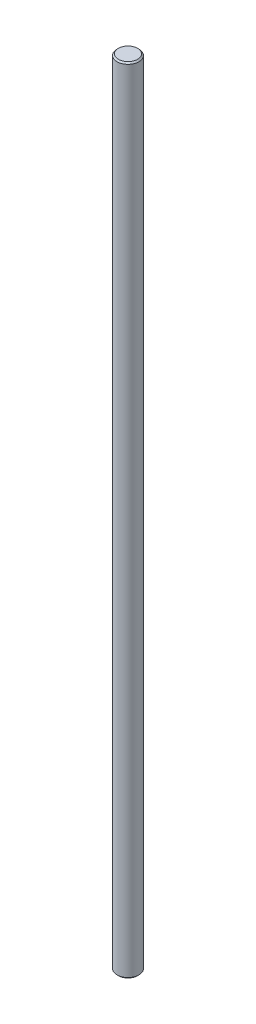
ISO-10303-21;
HEADER;
FILE_DESCRIPTION(('STEP AP214'),'2;1');
FILE_NAME('part.step','',(''),(''),'','','');
FILE_SCHEMA(('AUTOMOTIVE_DESIGN { 1 0 10303 214 1 1 1 1 }'));
ENDSEC;
DATA;
#1=APPLICATION_CONTEXT('core data for automotive mechanical design processes');
#2=APPLICATION_PROTOCOL_DEFINITION('international standard','automotive_design',2000,#1);
#3=PRODUCT_CONTEXT('',#1,'mechanical');
#4=PRODUCT('Part','Part','',(#3));
#5=PRODUCT_RELATED_PRODUCT_CATEGORY('part','',(#4));
#6=PRODUCT_DEFINITION_FORMATION('','',#4);
#7=PRODUCT_DEFINITION_CONTEXT('part definition',#1,'design');
#8=PRODUCT_DEFINITION('design','',#6,#7);
#9=PRODUCT_DEFINITION_SHAPE('','',#8);
#10=(LENGTH_UNIT() NAMED_UNIT(*) SI_UNIT(.MILLI.,.METRE.));
#11=(NAMED_UNIT(*) PLANE_ANGLE_UNIT() SI_UNIT($,.RADIAN.));
#12=(NAMED_UNIT(*) SI_UNIT($,.STERADIAN.) SOLID_ANGLE_UNIT());
#13=UNCERTAINTY_MEASURE_WITH_UNIT(LENGTH_MEASURE(1.E-05),#10,'distance_accuracy_value','');
#14=(GEOMETRIC_REPRESENTATION_CONTEXT(3) GLOBAL_UNCERTAINTY_ASSIGNED_CONTEXT((#13)) GLOBAL_UNIT_ASSIGNED_CONTEXT((#10,
#11,#12)) REPRESENTATION_CONTEXT('',''));
#15=CARTESIAN_POINT('',(0.,0.,0.));
#16=DIRECTION('',(0.,0.,1.));
#17=DIRECTION('',(1.,0.,0.));
#18=AXIS2_PLACEMENT_3D('',#15,#16,#17);
#19=CARTESIAN_POINT('',(0.,145.,0.));
#20=DIRECTION('',(0.,-1.,0.));
#21=DIRECTION('',(0.,0.,-1.));
#22=AXIS2_PLACEMENT_3D('',#19,#20,#21);
#23=CYLINDRICAL_SURFACE('',#22,4.);
#24=CARTESIAN_POINT('',(0.,-144.5,0.));
#25=DIRECTION('',(0.,1.,0.));
#26=DIRECTION('',(0.,0.,1.));
#27=AXIS2_PLACEMENT_3D('',#24,#25,#26);
#28=CIRCLE('',#27,4.);
#29=CARTESIAN_POINT('',(0.,-144.5,4.));
#30=VERTEX_POINT('',#29);
#31=EDGE_CURVE('E46',#30,#30,#28,.T.);
#32=ORIENTED_EDGE('',*,*,#31,.T.);
#33=EDGE_LOOP('',(#32));
#34=FACE_BOUND('',#33,.T.);
#35=CARTESIAN_POINT('',(0.,144.5,0.));
#36=DIRECTION('',(0.,1.,0.));
#37=DIRECTION('',(0.,0.,1.));
#38=AXIS2_PLACEMENT_3D('',#35,#36,#37);
#39=CIRCLE('',#38,4.);
#40=CARTESIAN_POINT('',(0.,144.5,4.));
#41=VERTEX_POINT('',#40);
#42=EDGE_CURVE('E50',#41,#41,#39,.F.);
#43=ORIENTED_EDGE('',*,*,#42,.T.);
#44=EDGE_LOOP('',(#43));
#45=FACE_BOUND('',#44,.T.);
#46=ADVANCED_FACE('F35',(#34,#45),#23,.T.);
#47=CARTESIAN_POINT('',(0.,145.,0.));
#48=DIRECTION('',(0.,1.,0.));
#49=DIRECTION('',(0.,0.,1.));
#50=AXIS2_PLACEMENT_3D('',#47,#48,#49);
#51=PLANE('',#50);
#52=CARTESIAN_POINT('',(0.,145.,0.));
#53=DIRECTION('',(0.,1.,0.));
#54=DIRECTION('',(0.,0.,1.));
#55=AXIS2_PLACEMENT_3D('',#52,#53,#54);
#56=CIRCLE('',#55,3.50000000000003);
#57=CARTESIAN_POINT('',(0.,145.,3.50000000000003));
#58=VERTEX_POINT('',#57);
#59=EDGE_CURVE('E10',#58,#58,#56,.T.);
#60=ORIENTED_EDGE('',*,*,#59,.T.);
#61=EDGE_LOOP('',(#60));
#62=FACE_BOUND('',#61,.T.);
#63=ADVANCED_FACE('F66',(#62),#51,.T.);
#64=CARTESIAN_POINT('',(0.,-145.,0.));
#65=DIRECTION('',(0.,1.,0.));
#66=DIRECTION('',(0.,0.,1.));
#67=AXIS2_PLACEMENT_3D('',#64,#65,#66);
#68=PLANE('',#67);
#69=CARTESIAN_POINT('',(0.,-145.,0.));
#70=DIRECTION('',(0.,1.,0.));
#71=DIRECTION('',(0.,0.,1.));
#72=AXIS2_PLACEMENT_3D('',#69,#70,#71);
#73=CIRCLE('',#72,3.49999999999995);
#74=CARTESIAN_POINT('',(0.,-145.,3.49999999999995));
#75=VERTEX_POINT('',#74);
#76=EDGE_CURVE('E42',#75,#75,#73,.F.);
#77=ORIENTED_EDGE('',*,*,#76,.T.);
#78=EDGE_LOOP('',(#77));
#79=FACE_BOUND('',#78,.T.);
#80=ADVANCED_FACE('F63',(#79),#68,.F.);
#81=CARTESIAN_POINT('',(0.,-144.5,0.));
#82=DIRECTION('',(0.,1.,0.));
#83=DIRECTION('',(0.,0.,1.));
#84=AXIS2_PLACEMENT_3D('',#81,#82,#83);
#85=CONICAL_SURFACE('',#84,4.,0.7853981633975);
#86=ORIENTED_EDGE('',*,*,#76,.F.);
#87=EDGE_LOOP('',(#86));
#88=FACE_BOUND('',#87,.T.);
#89=ORIENTED_EDGE('',*,*,#31,.F.);
#90=EDGE_LOOP('',(#89));
#91=FACE_BOUND('',#90,.T.);
#92=ADVANCED_FACE('F59',(#88,#91),#85,.T.);
#93=CARTESIAN_POINT('',(0.,145.,0.));
#94=DIRECTION('',(0.,-1.,0.));
#95=DIRECTION('',(0.,0.,-1.));
#96=AXIS2_PLACEMENT_3D('',#93,#94,#95);
#97=CONICAL_SURFACE('',#96,3.50000000000003,0.785398163397445);
#98=ORIENTED_EDGE('',*,*,#42,.F.);
#99=EDGE_LOOP('',(#98));
#100=FACE_BOUND('',#99,.T.);
#101=ORIENTED_EDGE('',*,*,#59,.F.);
#102=EDGE_LOOP('',(#101));
#103=FACE_BOUND('',#102,.T.);
#104=ADVANCED_FACE('F37',(#100,#103),#97,.T.);
#105=CLOSED_SHELL('',(#46,#63,#80,#92,#104));
#106=MANIFOLD_SOLID_BREP('B2',#105);
#107=ADVANCED_BREP_SHAPE_REPRESENTATION('',(#18,#106),#14);
#108=SHAPE_DEFINITION_REPRESENTATION(#9,#107);
ENDSEC;
END-ISO-10303-21;
